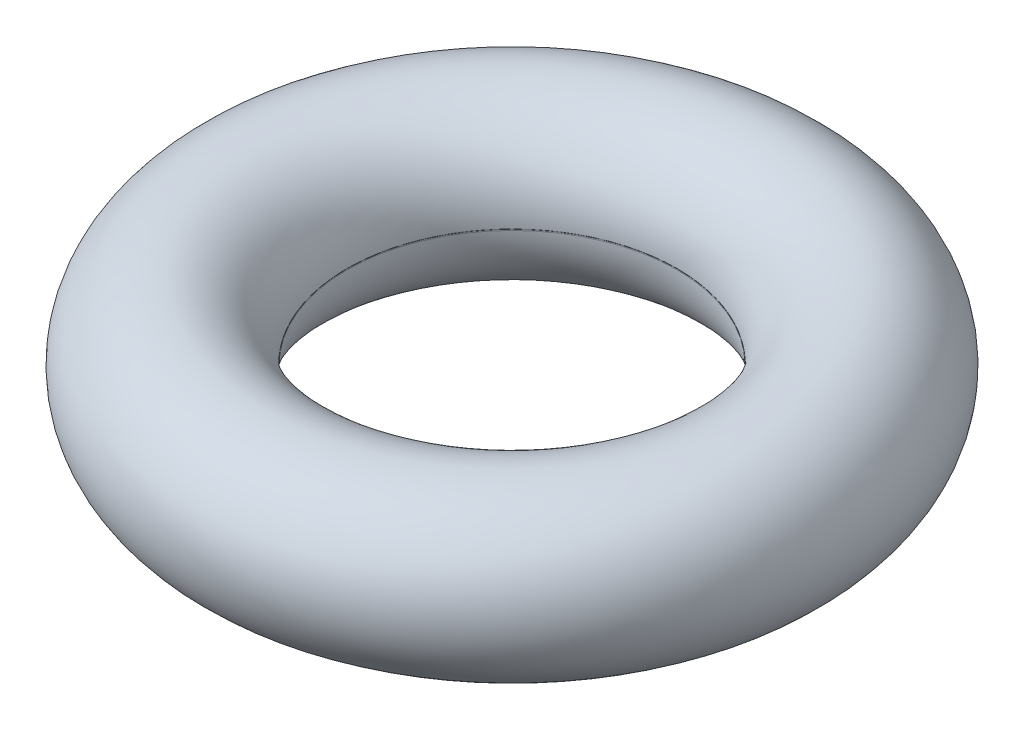
ISO-10303-21;
HEADER;
FILE_DESCRIPTION(('STEP AP214'),'2;1');
FILE_NAME('part.step','',(''),(''),'','','');
FILE_SCHEMA(('AUTOMOTIVE_DESIGN { 1 0 10303 214 1 1 1 1 }'));
ENDSEC;
DATA;
#1=APPLICATION_CONTEXT('core data for automotive mechanical design processes');
#2=APPLICATION_PROTOCOL_DEFINITION('international standard','automotive_design',2000,#1);
#3=PRODUCT_CONTEXT('',#1,'mechanical');
#4=PRODUCT('Part','Part','',(#3));
#5=PRODUCT_RELATED_PRODUCT_CATEGORY('part','',(#4));
#6=PRODUCT_DEFINITION_FORMATION('','',#4);
#7=PRODUCT_DEFINITION_CONTEXT('part definition',#1,'design');
#8=PRODUCT_DEFINITION('design','',#6,#7);
#9=PRODUCT_DEFINITION_SHAPE('','',#8);
#10=(LENGTH_UNIT() NAMED_UNIT(*) SI_UNIT(.MILLI.,.METRE.));
#11=(NAMED_UNIT(*) PLANE_ANGLE_UNIT() SI_UNIT($,.RADIAN.));
#12=(NAMED_UNIT(*) SI_UNIT($,.STERADIAN.) SOLID_ANGLE_UNIT());
#13=UNCERTAINTY_MEASURE_WITH_UNIT(LENGTH_MEASURE(1.E-05),#10,'distance_accuracy_value','');
#14=(GEOMETRIC_REPRESENTATION_CONTEXT(3) GLOBAL_UNCERTAINTY_ASSIGNED_CONTEXT((#13)) GLOBAL_UNIT_ASSIGNED_CONTEXT((#10,
#11,#12)) REPRESENTATION_CONTEXT('',''));
#15=CARTESIAN_POINT('',(0.,0.,0.));
#16=DIRECTION('',(0.,0.,1.));
#17=DIRECTION('',(1.,0.,0.));
#18=AXIS2_PLACEMENT_3D('',#15,#16,#17);
#19=CARTESIAN_POINT('',(0.,0.01,0.));
#20=DIRECTION('',(0.,1.,0.));
#21=DIRECTION('',(0.,0.,1.));
#22=AXIS2_PLACEMENT_3D('',#19,#20,#21);
#23=PLANE('',#22);
#24=CARTESIAN_POINT('',(0.,0.01,0.));
#25=DIRECTION('',(0.,1.,0.));
#26=DIRECTION('',(0.,0.,1.));
#27=AXIS2_PLACEMENT_3D('',#24,#25,#26);
#28=CIRCLE('',#27,1.505);
#29=CARTESIAN_POINT('',(0.,0.01,-1.505));
#30=VERTEX_POINT('',#29);
#31=EDGE_CURVE('E12',#30,#30,#28,.T.);
#32=ORIENTED_EDGE('',*,*,#31,.T.);
#33=EDGE_LOOP('',(#32));
#34=FACE_BOUND('',#33,.T.);
#35=CARTESIAN_POINT('',(0.,0.01,0.));
#36=DIRECTION('',(0.,1.,0.));
#37=DIRECTION('',(0.,0.,1.));
#38=AXIS2_PLACEMENT_3D('',#35,#36,#37);
#39=CIRCLE('',#38,1.5);
#40=CARTESIAN_POINT('',(0.,0.01,-1.5));
#41=VERTEX_POINT('',#40);
#42=EDGE_CURVE('E59',#41,#41,#39,.T.);
#43=ORIENTED_EDGE('',*,*,#42,.F.);
#44=EDGE_LOOP('',(#43));
#45=FACE_BOUND('',#44,.T.);
#46=ADVANCED_FACE('F48',(#34,#45),#23,.T.);
#47=CARTESIAN_POINT('',(0.,0.,0.));
#48=DIRECTION('',(0.,1.,0.));
#49=DIRECTION('',(0.,0.,1.));
#50=AXIS2_PLACEMENT_3D('',#47,#48,#49);
#51=PLANE('',#50);
#52=CARTESIAN_POINT('',(0.,0.,0.));
#53=DIRECTION('',(0.,1.,0.));
#54=DIRECTION('',(0.,0.,1.));
#55=AXIS2_PLACEMENT_3D('',#52,#53,#54);
#56=CIRCLE('',#55,1.505);
#57=CARTESIAN_POINT('',(0.,0.,-1.505));
#58=VERTEX_POINT('',#57);
#59=EDGE_CURVE('E52',#58,#58,#56,.T.);
#60=ORIENTED_EDGE('',*,*,#59,.F.);
#61=EDGE_LOOP('',(#60));
#62=FACE_BOUND('',#61,.T.);
#63=CARTESIAN_POINT('',(0.,0.,0.));
#64=DIRECTION('',(0.,1.,0.));
#65=DIRECTION('',(0.,0.,1.));
#66=AXIS2_PLACEMENT_3D('',#63,#64,#65);
#67=CIRCLE('',#66,1.5);
#68=CARTESIAN_POINT('',(0.,0.,-1.5));
#69=VERTEX_POINT('',#68);
#70=EDGE_CURVE('E61',#69,#69,#67,.T.);
#71=ORIENTED_EDGE('',*,*,#70,.T.);
#72=EDGE_LOOP('',(#71));
#73=FACE_BOUND('',#72,.T.);
#74=ADVANCED_FACE('F71',(#62,#73),#51,.F.);
#75=CARTESIAN_POINT('',(0.,0.01,0.));
#76=DIRECTION('',(0.,-1.,0.));
#77=DIRECTION('',(0.,0.,-1.));
#78=AXIS2_PLACEMENT_3D('',#75,#76,#77);
#79=CYLINDRICAL_SURFACE('',#78,1.505);
#80=CARTESIAN_POINT('',(0.,0.01,-1.505));
#81=CARTESIAN_POINT('',(0.,0.00989583333333333,-1.505));
#82=CARTESIAN_POINT('',(0.,0.00979166666666667,-1.505));
#83=CARTESIAN_POINT('',(0.,0.00958333333333333,-1.505));
#84=CARTESIAN_POINT('',(0.,0.00947916666666667,-1.505));
#85=CARTESIAN_POINT('',(0.,0.00927083333333333,-1.505));
#86=CARTESIAN_POINT('',(0.,0.00916666666666667,-1.505));
#87=CARTESIAN_POINT('',(0.,0.00895833333333333,-1.505));
#88=CARTESIAN_POINT('',(0.,0.00885416666666667,-1.505));
#89=CARTESIAN_POINT('',(0.,0.00864583333333333,-1.505));
#90=CARTESIAN_POINT('',(0.,0.00854166666666667,-1.505));
#91=CARTESIAN_POINT('',(0.,0.00833333333333333,-1.505));
#92=CARTESIAN_POINT('',(0.,0.00822916666666667,-1.505));
#93=CARTESIAN_POINT('',(0.,0.00802083333333333,-1.505));
#94=CARTESIAN_POINT('',(0.,0.00791666666666667,-1.505));
#95=CARTESIAN_POINT('',(0.,0.00770833333333333,-1.505));
#96=CARTESIAN_POINT('',(0.,0.00760416666666667,-1.505));
#97=CARTESIAN_POINT('',(0.,0.00739583333333333,-1.505));
#98=CARTESIAN_POINT('',(0.,0.00729166666666667,-1.505));
#99=CARTESIAN_POINT('',(0.,0.00708333333333333,-1.505));
#100=CARTESIAN_POINT('',(0.,0.00697916666666667,-1.505));
#101=CARTESIAN_POINT('',(0.,0.00677083333333333,-1.505));
#102=CARTESIAN_POINT('',(0.,0.00666666666666667,-1.505));
#103=CARTESIAN_POINT('',(0.,0.00645833333333333,-1.505));
#104=CARTESIAN_POINT('',(0.,0.00635416666666667,-1.505));
#105=CARTESIAN_POINT('',(0.,0.00614583333333333,-1.505));
#106=CARTESIAN_POINT('',(0.,0.00604166666666667,-1.505));
#107=CARTESIAN_POINT('',(0.,0.00583333333333333,-1.505));
#108=CARTESIAN_POINT('',(0.,0.00572916666666667,-1.505));
#109=CARTESIAN_POINT('',(0.,0.00552083333333333,-1.505));
#110=CARTESIAN_POINT('',(0.,0.00541666666666667,-1.505));
#111=CARTESIAN_POINT('',(0.,0.00520833333333333,-1.505));
#112=CARTESIAN_POINT('',(0.,0.00510416666666667,-1.505));
#113=CARTESIAN_POINT('',(0.,0.00489583333333333,-1.505));
#114=CARTESIAN_POINT('',(0.,0.00479166666666667,-1.505));
#115=CARTESIAN_POINT('',(0.,0.00458333333333333,-1.505));
#116=CARTESIAN_POINT('',(0.,0.00447916666666667,-1.505));
#117=CARTESIAN_POINT('',(0.,0.00427083333333333,-1.505));
#118=CARTESIAN_POINT('',(0.,0.00416666666666667,-1.505));
#119=CARTESIAN_POINT('',(0.,0.00395833333333333,-1.505));
#120=CARTESIAN_POINT('',(0.,0.00385416666666667,-1.505));
#121=CARTESIAN_POINT('',(0.,0.00364583333333333,-1.505));
#122=CARTESIAN_POINT('',(0.,0.00354166666666667,-1.505));
#123=CARTESIAN_POINT('',(0.,0.00333333333333333,-1.505));
#124=CARTESIAN_POINT('',(0.,0.00322916666666667,-1.505));
#125=CARTESIAN_POINT('',(0.,0.00302083333333333,-1.505));
#126=CARTESIAN_POINT('',(0.,0.00291666666666667,-1.505));
#127=CARTESIAN_POINT('',(0.,0.00270833333333333,-1.505));
#128=CARTESIAN_POINT('',(0.,0.00260416666666667,-1.505));
#129=CARTESIAN_POINT('',(0.,0.00239583333333333,-1.505));
#130=CARTESIAN_POINT('',(0.,0.00229166666666667,-1.505));
#131=CARTESIAN_POINT('',(0.,0.00208333333333333,-1.505));
#132=CARTESIAN_POINT('',(0.,0.00197916666666667,-1.505));
#133=CARTESIAN_POINT('',(0.,0.00177083333333333,-1.505));
#134=CARTESIAN_POINT('',(0.,0.00166666666666667,-1.505));
#135=CARTESIAN_POINT('',(0.,0.00145833333333333,-1.505));
#136=CARTESIAN_POINT('',(0.,0.00135416666666667,-1.505));
#137=CARTESIAN_POINT('',(0.,0.00114583333333333,-1.505));
#138=CARTESIAN_POINT('',(0.,0.00104166666666667,-1.505));
#139=CARTESIAN_POINT('',(0.,0.000833333333333334,-1.505));
#140=CARTESIAN_POINT('',(0.,0.000729166666666667,-1.505));
#141=CARTESIAN_POINT('',(0.,0.000520833333333334,-1.505));
#142=CARTESIAN_POINT('',(0.,0.000416666666666667,-1.505));
#143=CARTESIAN_POINT('',(0.,0.000208333333333334,-1.505));
#144=CARTESIAN_POINT('',(0.,0.000104166666666667,-1.505));
#145=CARTESIAN_POINT('',(0.,0.,-1.505));
#146=B_SPLINE_CURVE_WITH_KNOTS('',3,(#80,#81,#82,#83,#84,#85,#86,#87,#88,#89,#90,#91,#92,#93,
#94,#95,#96,#97,#98,#99,#100,#101,#102,#103,#104,#105,#106,#107,#108,#109,#110,#111,#112,#113,
#114,#115,#116,#117,#118,#119,#120,#121,#122,#123,#124,#125,#126,#127,#128,#129,#130,#131,#132,
#133,#134,#135,#136,#137,#138,#139,#140,#141,#142,#143,#144,#145),.UNSPECIFIED.,.F.,.F.,(4,2,2,
2,2,2,2,2,2,2,2,2,2,2,2,2,2,2,2,2,2,2,2,2,2,2,2,2,2,2,2,2,4),(0.,0.000312499999999999,
0.000624999999999998,0.000937499999999999,0.00125,0.0015625,0.001875,0.0021875,0.0025,0.0028125,
0.003125,0.0034375,0.00375,0.0040625,0.004375,0.0046875,0.005,0.0053125,0.005625,0.0059375,
0.00625,0.0065625,0.006875,0.0071875,0.0075,0.0078125,0.008125,0.0084375,0.00875,0.0090625,
0.009375,0.0096875,0.01),.UNSPECIFIED.);
#147=EDGE_CURVE('BSEAM50',#30,#58,#146,.T.);
#148=ORIENTED_EDGE('',*,*,#31,.F.);
#149=ORIENTED_EDGE('',*,*,#59,.T.);
#150=ORIENTED_EDGE('',*,*,#147,.T.);
#151=ORIENTED_EDGE('',*,*,#147,.F.);
#152=EDGE_LOOP('',(#148,#150,#149,#151));
#153=FACE_BOUND('',#152,.T.);
#154=ADVANCED_FACE('F50',(#153),#79,.T.);
#155=CARTESIAN_POINT('',(0.,0.01,0.));
#156=DIRECTION('',(0.,-1.,0.));
#157=DIRECTION('',(0.,0.,-1.));
#158=AXIS2_PLACEMENT_3D('',#155,#156,#157);
#159=CYLINDRICAL_SURFACE('',#158,1.5);
#160=CARTESIAN_POINT('',(0.,0.01,-1.5));
#161=CARTESIAN_POINT('',(0.,0.00989583333333333,-1.5));
#162=CARTESIAN_POINT('',(0.,0.00979166666666667,-1.5));
#163=CARTESIAN_POINT('',(0.,0.00958333333333333,-1.5));
#164=CARTESIAN_POINT('',(0.,0.00947916666666667,-1.5));
#165=CARTESIAN_POINT('',(0.,0.00927083333333333,-1.5));
#166=CARTESIAN_POINT('',(0.,0.00916666666666667,-1.5));
#167=CARTESIAN_POINT('',(0.,0.00895833333333333,-1.5));
#168=CARTESIAN_POINT('',(0.,0.00885416666666667,-1.5));
#169=CARTESIAN_POINT('',(0.,0.00864583333333333,-1.5));
#170=CARTESIAN_POINT('',(0.,0.00854166666666667,-1.5));
#171=CARTESIAN_POINT('',(0.,0.00833333333333333,-1.5));
#172=CARTESIAN_POINT('',(0.,0.00822916666666667,-1.5));
#173=CARTESIAN_POINT('',(0.,0.00802083333333333,-1.5));
#174=CARTESIAN_POINT('',(0.,0.00791666666666667,-1.5));
#175=CARTESIAN_POINT('',(0.,0.00770833333333333,-1.5));
#176=CARTESIAN_POINT('',(0.,0.00760416666666667,-1.5));
#177=CARTESIAN_POINT('',(0.,0.00739583333333333,-1.5));
#178=CARTESIAN_POINT('',(0.,0.00729166666666667,-1.5));
#179=CARTESIAN_POINT('',(0.,0.00708333333333333,-1.5));
#180=CARTESIAN_POINT('',(0.,0.00697916666666667,-1.5));
#181=CARTESIAN_POINT('',(0.,0.00677083333333333,-1.5));
#182=CARTESIAN_POINT('',(0.,0.00666666666666667,-1.5));
#183=CARTESIAN_POINT('',(0.,0.00645833333333333,-1.5));
#184=CARTESIAN_POINT('',(0.,0.00635416666666667,-1.5));
#185=CARTESIAN_POINT('',(0.,0.00614583333333333,-1.5));
#186=CARTESIAN_POINT('',(0.,0.00604166666666667,-1.5));
#187=CARTESIAN_POINT('',(0.,0.00583333333333333,-1.5));
#188=CARTESIAN_POINT('',(0.,0.00572916666666667,-1.5));
#189=CARTESIAN_POINT('',(0.,0.00552083333333333,-1.5));
#190=CARTESIAN_POINT('',(0.,0.00541666666666667,-1.5));
#191=CARTESIAN_POINT('',(0.,0.00520833333333333,-1.5));
#192=CARTESIAN_POINT('',(0.,0.00510416666666667,-1.5));
#193=CARTESIAN_POINT('',(0.,0.00489583333333333,-1.5));
#194=CARTESIAN_POINT('',(0.,0.00479166666666667,-1.5));
#195=CARTESIAN_POINT('',(0.,0.00458333333333333,-1.5));
#196=CARTESIAN_POINT('',(0.,0.00447916666666667,-1.5));
#197=CARTESIAN_POINT('',(0.,0.00427083333333333,-1.5));
#198=CARTESIAN_POINT('',(0.,0.00416666666666667,-1.5));
#199=CARTESIAN_POINT('',(0.,0.00395833333333333,-1.5));
#200=CARTESIAN_POINT('',(0.,0.00385416666666667,-1.5));
#201=CARTESIAN_POINT('',(0.,0.00364583333333333,-1.5));
#202=CARTESIAN_POINT('',(0.,0.00354166666666667,-1.5));
#203=CARTESIAN_POINT('',(0.,0.00333333333333333,-1.5));
#204=CARTESIAN_POINT('',(0.,0.00322916666666667,-1.5));
#205=CARTESIAN_POINT('',(0.,0.00302083333333333,-1.5));
#206=CARTESIAN_POINT('',(0.,0.00291666666666667,-1.5));
#207=CARTESIAN_POINT('',(0.,0.00270833333333333,-1.5));
#208=CARTESIAN_POINT('',(0.,0.00260416666666667,-1.5));
#209=CARTESIAN_POINT('',(0.,0.00239583333333333,-1.5));
#210=CARTESIAN_POINT('',(0.,0.00229166666666667,-1.5));
#211=CARTESIAN_POINT('',(0.,0.00208333333333333,-1.5));
#212=CARTESIAN_POINT('',(0.,0.00197916666666667,-1.5));
#213=CARTESIAN_POINT('',(0.,0.00177083333333333,-1.5));
#214=CARTESIAN_POINT('',(0.,0.00166666666666667,-1.5));
#215=CARTESIAN_POINT('',(0.,0.00145833333333333,-1.5));
#216=CARTESIAN_POINT('',(0.,0.00135416666666667,-1.5));
#217=CARTESIAN_POINT('',(0.,0.00114583333333333,-1.5));
#218=CARTESIAN_POINT('',(0.,0.00104166666666667,-1.5));
#219=CARTESIAN_POINT('',(0.,0.000833333333333334,-1.5));
#220=CARTESIAN_POINT('',(0.,0.000729166666666667,-1.5));
#221=CARTESIAN_POINT('',(0.,0.000520833333333334,-1.5));
#222=CARTESIAN_POINT('',(0.,0.000416666666666667,-1.5));
#223=CARTESIAN_POINT('',(0.,0.000208333333333334,-1.5));
#224=CARTESIAN_POINT('',(0.,0.000104166666666667,-1.5));
#225=CARTESIAN_POINT('',(0.,0.,-1.5));
#226=B_SPLINE_CURVE_WITH_KNOTS('',3,(#160,#161,#162,#163,#164,#165,#166,#167,#168,#169,#170,
#171,#172,#173,#174,#175,#176,#177,#178,#179,#180,#181,#182,#183,#184,#185,#186,#187,#188,#189,
#190,#191,#192,#193,#194,#195,#196,#197,#198,#199,#200,#201,#202,#203,#204,#205,#206,#207,#208,
#209,#210,#211,#212,#213,#214,#215,#216,#217,#218,#219,#220,#221,#222,#223,#224,#225),
.UNSPECIFIED.,.F.,.F.,(4,2,2,2,2,2,2,2,2,2,2,2,2,2,2,2,2,2,2,2,2,2,2,2,2,2,2,2,2,2,2,2,4),(0.,
0.000312500000000001,0.000625000000000002,0.000937500000000001,0.00125,0.0015625,0.001875,
0.0021875,0.0025,0.0028125,0.003125,0.0034375,0.00375,0.0040625,0.004375,0.0046875,0.005,
0.0053125,0.005625,0.0059375,0.00625,0.0065625,0.006875,0.0071875,0.0075,0.0078125,0.008125,
0.0084375,0.00875,0.0090625,0.009375,0.0096875,0.01),.UNSPECIFIED.);
#227=EDGE_CURVE('BSEAM67',#41,#69,#226,.T.);
#228=ORIENTED_EDGE('',*,*,#42,.T.);
#229=ORIENTED_EDGE('',*,*,#70,.F.);
#230=ORIENTED_EDGE('',*,*,#227,.T.);
#231=ORIENTED_EDGE('',*,*,#227,.F.);
#232=EDGE_LOOP('',(#228,#230,#229,#231));
#233=FACE_BOUND('',#232,.T.);
#234=ADVANCED_FACE('F67',(#233),#159,.F.);
#235=CLOSED_SHELL('',(#46,#74,#154,#234));
#236=MANIFOLD_SOLID_BREP('B2',#235);
#237=CARTESIAN_POINT('',(0.,0.,0.));
#238=DIRECTION('',(0.,-1.,0.));
#239=DIRECTION('',(0.,0.,-1.));
#240=AXIS2_PLACEMENT_3D('',#237,#238,#239);
#241=TOROIDAL_SURFACE('',#240,2.25,0.75);
#242=CARTESIAN_POINT('',(0.,0.,-3.));
#243=VERTEX_POINT('',#242);
#244=VERTEX_LOOP('',#243);
#245=FACE_BOUND('',#244,.T.);
#246=ADVANCED_FACE('F109',(#245),#241,.T.);
#247=CLOSED_SHELL('',(#246));
#248=MANIFOLD_SOLID_BREP('B7',#247);
#249=ADVANCED_BREP_SHAPE_REPRESENTATION('',(#18,#236,#248),#14);
#250=SHAPE_DEFINITION_REPRESENTATION(#9,#249);
ENDSEC;
END-ISO-10303-21;
